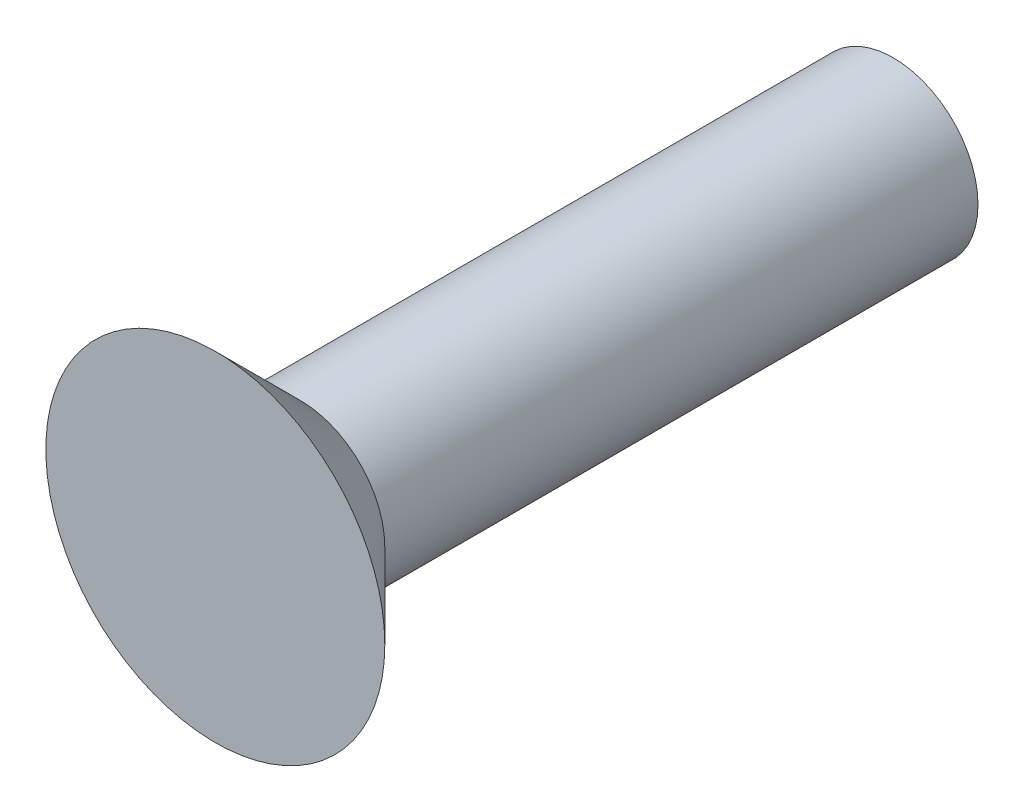
ISO-10303-21;
HEADER;
FILE_DESCRIPTION(('STEP AP214'),'2;1');
FILE_NAME('part.step','',(''),(''),'','','');
FILE_SCHEMA(('AUTOMOTIVE_DESIGN { 1 0 10303 214 1 1 1 1 }'));
ENDSEC;
DATA;
#1=APPLICATION_CONTEXT('core data for automotive mechanical design processes');
#2=APPLICATION_PROTOCOL_DEFINITION('international standard','automotive_design',2000,#1);
#3=PRODUCT_CONTEXT('',#1,'mechanical');
#4=PRODUCT('Part','Part','',(#3));
#5=PRODUCT_RELATED_PRODUCT_CATEGORY('part','',(#4));
#6=PRODUCT_DEFINITION_FORMATION('','',#4);
#7=PRODUCT_DEFINITION_CONTEXT('part definition',#1,'design');
#8=PRODUCT_DEFINITION('design','',#6,#7);
#9=PRODUCT_DEFINITION_SHAPE('','',#8);
#10=(LENGTH_UNIT() NAMED_UNIT(*) SI_UNIT(.MILLI.,.METRE.));
#11=(NAMED_UNIT(*) PLANE_ANGLE_UNIT() SI_UNIT($,.RADIAN.));
#12=(NAMED_UNIT(*) SI_UNIT($,.STERADIAN.) SOLID_ANGLE_UNIT());
#13=UNCERTAINTY_MEASURE_WITH_UNIT(LENGTH_MEASURE(1.E-05),#10,'distance_accuracy_value','');
#14=(GEOMETRIC_REPRESENTATION_CONTEXT(3) GLOBAL_UNCERTAINTY_ASSIGNED_CONTEXT((#13)) GLOBAL_UNIT_ASSIGNED_CONTEXT((#10,
#11,#12)) REPRESENTATION_CONTEXT('',''));
#15=CARTESIAN_POINT('',(0.,0.,0.));
#16=DIRECTION('',(0.,0.,1.));
#17=DIRECTION('',(1.,0.,0.));
#18=AXIS2_PLACEMENT_3D('',#15,#16,#17);
#19=CARTESIAN_POINT('',(0.,0.,0.));
#20=DIRECTION('',(0.,0.,1.));
#21=DIRECTION('',(1.,0.,0.));
#22=AXIS2_PLACEMENT_3D('',#19,#20,#21);
#23=CONICAL_SURFACE('',#22,2.5,0.785398163397448);
#24=CARTESIAN_POINT('',(0.,0.,-1.25));
#25=DIRECTION('',(0.,0.,1.));
#26=DIRECTION('',(1.,0.,0.));
#27=AXIS2_PLACEMENT_3D('',#24,#25,#26);
#28=CIRCLE('',#27,1.25);
#29=CARTESIAN_POINT('',(1.25,0.,-1.25));
#30=VERTEX_POINT('',#29);
#31=EDGE_CURVE('E43',#30,#30,#28,.T.);
#32=ORIENTED_EDGE('',*,*,#31,.T.);
#33=EDGE_LOOP('',(#32));
#34=FACE_BOUND('',#33,.T.);
#35=CARTESIAN_POINT('',(0.,0.,0.));
#36=DIRECTION('',(0.,0.,1.));
#37=DIRECTION('',(1.,0.,0.));
#38=AXIS2_PLACEMENT_3D('',#35,#36,#37);
#39=CIRCLE('',#38,2.5);
#40=CARTESIAN_POINT('',(2.5,0.,0.));
#41=VERTEX_POINT('',#40);
#42=EDGE_CURVE('E10',#41,#41,#39,.T.);
#43=ORIENTED_EDGE('',*,*,#42,.F.);
#44=EDGE_LOOP('',(#43));
#45=FACE_BOUND('',#44,.T.);
#46=ADVANCED_FACE('F40',(#34,#45),#23,.T.);
#47=CARTESIAN_POINT('',(0.,0.,0.));
#48=DIRECTION('',(0.,0.,1.));
#49=DIRECTION('',(1.,0.,0.));
#50=AXIS2_PLACEMENT_3D('',#47,#48,#49);
#51=PLANE('',#50);
#52=ORIENTED_EDGE('',*,*,#42,.T.);
#53=EDGE_LOOP('',(#52));
#54=FACE_BOUND('',#53,.T.);
#55=ADVANCED_FACE('F65',(#54),#51,.T.);
#56=CARTESIAN_POINT('',(0.,0.,-1.25));
#57=DIRECTION('',(0.,0.,-1.));
#58=DIRECTION('',(-1.,0.,0.));
#59=AXIS2_PLACEMENT_3D('',#56,#57,#58);
#60=CYLINDRICAL_SURFACE('',#59,1.25);
#61=ORIENTED_EDGE('',*,*,#31,.F.);
#62=EDGE_LOOP('',(#61));
#63=FACE_BOUND('',#62,.T.);
#64=CARTESIAN_POINT('',(0.,0.,-10.));
#65=DIRECTION('',(0.,0.,1.));
#66=DIRECTION('',(1.,0.,0.));
#67=AXIS2_PLACEMENT_3D('',#64,#65,#66);
#68=CIRCLE('',#67,1.25);
#69=CARTESIAN_POINT('',(1.25,0.,-10.));
#70=VERTEX_POINT('',#69);
#71=EDGE_CURVE('E50',#70,#70,#68,.T.);
#72=ORIENTED_EDGE('',*,*,#71,.T.);
#73=EDGE_LOOP('',(#72));
#74=FACE_BOUND('',#73,.T.);
#75=ADVANCED_FACE('F53',(#63,#74),#60,.T.);
#76=CARTESIAN_POINT('',(0.,0.,-10.));
#77=DIRECTION('',(0.,0.,1.));
#78=DIRECTION('',(1.,0.,0.));
#79=AXIS2_PLACEMENT_3D('',#76,#77,#78);
#80=PLANE('',#79);
#81=ORIENTED_EDGE('',*,*,#71,.F.);
#82=EDGE_LOOP('',(#81));
#83=FACE_BOUND('',#82,.T.);
#84=ADVANCED_FACE('F57',(#83),#80,.F.);
#85=CLOSED_SHELL('',(#46,#55,#75,#84));
#86=MANIFOLD_SOLID_BREP('B2',#85);
#87=ADVANCED_BREP_SHAPE_REPRESENTATION('',(#18,#86),#14);
#88=SHAPE_DEFINITION_REPRESENTATION(#9,#87);
ENDSEC;
END-ISO-10303-21;
